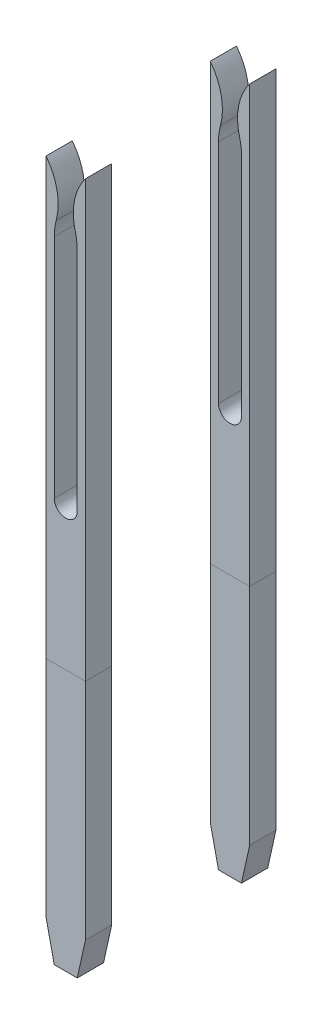
ISO-10303-21;
HEADER;
FILE_DESCRIPTION(('STEP AP214'),'2;1');
FILE_NAME('part.step','',(''),(''),'','','');
FILE_SCHEMA(('AUTOMOTIVE_DESIGN { 1 0 10303 214 1 1 1 1 }'));
ENDSEC;
DATA;
#1=APPLICATION_CONTEXT('core data for automotive mechanical design processes');
#2=APPLICATION_PROTOCOL_DEFINITION('international standard','automotive_design',2000,#1);
#3=PRODUCT_CONTEXT('',#1,'mechanical');
#4=PRODUCT('Part','Part','',(#3));
#5=PRODUCT_RELATED_PRODUCT_CATEGORY('part','',(#4));
#6=PRODUCT_DEFINITION_FORMATION('','',#4);
#7=PRODUCT_DEFINITION_CONTEXT('part definition',#1,'design');
#8=PRODUCT_DEFINITION('design','',#6,#7);
#9=PRODUCT_DEFINITION_SHAPE('','',#8);
#10=(LENGTH_UNIT() NAMED_UNIT(*) SI_UNIT(.MILLI.,.METRE.));
#11=(NAMED_UNIT(*) PLANE_ANGLE_UNIT() SI_UNIT($,.RADIAN.));
#12=(NAMED_UNIT(*) SI_UNIT($,.STERADIAN.) SOLID_ANGLE_UNIT());
#13=UNCERTAINTY_MEASURE_WITH_UNIT(LENGTH_MEASURE(1.E-05),#10,'distance_accuracy_value','');
#14=(GEOMETRIC_REPRESENTATION_CONTEXT(3) GLOBAL_UNCERTAINTY_ASSIGNED_CONTEXT((#13)) GLOBAL_UNIT_ASSIGNED_CONTEXT((#10,
#11,#12)) REPRESENTATION_CONTEXT('',''));
#15=CARTESIAN_POINT('',(0.,0.,0.));
#16=DIRECTION('',(0.,0.,1.));
#17=DIRECTION('',(1.,0.,0.));
#18=AXIS2_PLACEMENT_3D('',#15,#16,#17);
#19=CARTESIAN_POINT('',(0.72644,6.35,3.82274948026913));
#20=DIRECTION('',(0.,0.,-1.));
#21=DIRECTION('',(-1.,0.,0.));
#22=AXIS2_PLACEMENT_3D('',#19,#20,#21);
#23=CYLINDRICAL_SURFACE('',#22,0.90424);
#24=CARTESIAN_POINT('',(0.72644,6.35,-1.0668));
#25=DIRECTION('',(0.,0.,-1.));
#26=DIRECTION('',(0.,1.,0.));
#27=AXIS2_PLACEMENT_3D('',#24,#25,#26);
#28=CIRCLE('',#27,0.90424);
#29=CARTESIAN_POINT('',(-0.1778,6.35,-1.0668));
#30=VERTEX_POINT('',#29);
#31=CARTESIAN_POINT('',(-0.147467238827182,6.58224150259041,-1.0668));
#32=VERTEX_POINT('',#31);
#33=EDGE_CURVE('P0_E179',#30,#32,#28,.T.);
#34=ORIENTED_EDGE('',*,*,#33,.F.);
#35=DIRECTION('',(0.,0.,-1.));
#36=VECTOR('',#35,1.);
#37=CARTESIAN_POINT('',(-0.1778,6.35,3.82274948026913));
#38=LINE('',#37,#36);
#39=CARTESIAN_POINT('',(-0.1778,6.35,-1.4732));
#40=VERTEX_POINT('',#39);
#41=EDGE_CURVE('P0_E11',#30,#40,#38,.T.);
#42=ORIENTED_EDGE('',*,*,#41,.T.);
#43=CARTESIAN_POINT('',(0.72644,6.35,-1.4732));
#44=DIRECTION('',(0.,0.,1.));
#45=DIRECTION('',(0.,1.,0.));
#46=AXIS2_PLACEMENT_3D('',#43,#44,#45);
#47=CIRCLE('',#46,0.90424);
#48=CARTESIAN_POINT('',(-0.147467238827182,6.58224150259041,-1.4732));
#49=VERTEX_POINT('',#48);
#50=EDGE_CURVE('P0_E151',#49,#40,#47,.T.);
#51=ORIENTED_EDGE('',*,*,#50,.F.);
#52=DIRECTION('',(0.,0.,-1.));
#53=VECTOR('',#52,1.);
#54=CARTESIAN_POINT('',(-0.147467238827182,6.58224150259041,3.82274948026913));
#55=LINE('',#54,#53);
#56=EDGE_CURVE('P0_E42',#32,#49,#55,.T.);
#57=ORIENTED_EDGE('',*,*,#56,.F.);
#58=EDGE_LOOP('',(#34,#42,#51,#57));
#59=FACE_BOUND('',#58,.T.);
#60=ADVANCED_FACE('P0_F17',(#59),#23,.F.);
#61=CARTESIAN_POINT('',(-0.1778,0.,3.82274948026913));
#62=DIRECTION('',(1.,0.,0.));
#63=DIRECTION('',(0.,1.,0.));
#64=AXIS2_PLACEMENT_3D('',#61,#62,#63);
#65=PLANE('',#64);
#66=DIRECTION('',(0.,1.,0.));
#67=VECTOR('',#66,1.);
#68=CARTESIAN_POINT('',(-0.1778,0.,-1.0668));
#69=LINE('',#68,#67);
#70=CARTESIAN_POINT('',(-0.1778,2.8448,-1.0668));
#71=VERTEX_POINT('',#70);
#72=EDGE_CURVE('P0_E149',#71,#30,#69,.T.);
#73=ORIENTED_EDGE('',*,*,#72,.F.);
#74=DIRECTION('',(0.,0.,-1.));
#75=VECTOR('',#74,1.);
#76=CARTESIAN_POINT('',(-0.1778,2.8448,3.82274948026913));
#77=LINE('',#76,#75);
#78=CARTESIAN_POINT('',(-0.1778,2.8448,-1.4732));
#79=VERTEX_POINT('',#78);
#80=EDGE_CURVE('P0_E28',#71,#79,#77,.T.);
#81=ORIENTED_EDGE('',*,*,#80,.T.);
#82=DIRECTION('',(0.,-1.,0.));
#83=VECTOR('',#82,1.);
#84=CARTESIAN_POINT('',(-0.1778,0.,-1.4732));
#85=LINE('',#84,#83);
#86=EDGE_CURVE('P0_E155',#40,#79,#85,.T.);
#87=ORIENTED_EDGE('',*,*,#86,.F.);
#88=ORIENTED_EDGE('',*,*,#41,.F.);
#89=EDGE_LOOP('',(#73,#81,#87,#88));
#90=FACE_BOUND('',#89,.T.);
#91=ADVANCED_FACE('P0_F401',(#90),#65,.T.);
#92=CARTESIAN_POINT('',(0.,2.8448,3.82274948026913));
#93=DIRECTION('',(0.,0.,-1.));
#94=DIRECTION('',(-1.,0.,0.));
#95=AXIS2_PLACEMENT_3D('',#92,#93,#94);
#96=CYLINDRICAL_SURFACE('',#95,0.1778);
#97=ORIENTED_EDGE('',*,*,#80,.F.);
#98=CARTESIAN_POINT('',(0.,2.8448,-1.0668));
#99=DIRECTION('',(0.,0.,1.));
#100=DIRECTION('',(0.,1.,0.));
#101=AXIS2_PLACEMENT_3D('',#98,#99,#100);
#102=CIRCLE('',#101,0.1778);
#103=CARTESIAN_POINT('',(0.1778,2.8448,-1.0668));
#104=VERTEX_POINT('',#103);
#105=EDGE_CURVE('P0_E187',#71,#104,#102,.T.);
#106=ORIENTED_EDGE('',*,*,#105,.T.);
#107=DIRECTION('',(0.,0.,-1.));
#108=VECTOR('',#107,1.);
#109=CARTESIAN_POINT('',(0.1778,2.8448,3.82274948026913));
#110=LINE('',#109,#108);
#111=CARTESIAN_POINT('',(0.1778,2.8448,-1.4732));
#112=VERTEX_POINT('',#111);
#113=EDGE_CURVE('P0_E183',#104,#112,#110,.T.);
#114=ORIENTED_EDGE('',*,*,#113,.T.);
#115=CARTESIAN_POINT('',(0.,2.8448,-1.4732));
#116=DIRECTION('',(0.,0.,-1.));
#117=DIRECTION('',(0.,1.,0.));
#118=AXIS2_PLACEMENT_3D('',#115,#116,#117);
#119=CIRCLE('',#118,0.1778);
#120=EDGE_CURVE('P0_E207',#112,#79,#119,.T.);
#121=ORIENTED_EDGE('',*,*,#120,.T.);
#122=EDGE_LOOP('',(#97,#106,#114,#121));
#123=FACE_BOUND('',#122,.T.);
#124=ADVANCED_FACE('P0_F236',(#123),#96,.F.);
#125=CARTESIAN_POINT('',(0.1778,0.,3.82274948026913));
#126=DIRECTION('',(1.,0.,0.));
#127=DIRECTION('',(0.,1.,0.));
#128=AXIS2_PLACEMENT_3D('',#125,#126,#127);
#129=PLANE('',#128);
#130=ORIENTED_EDGE('',*,*,#113,.F.);
#131=DIRECTION('',(0.,1.,0.));
#132=VECTOR('',#131,1.);
#133=CARTESIAN_POINT('',(0.1778,0.,-1.0668));
#134=LINE('',#133,#132);
#135=CARTESIAN_POINT('',(0.1778,6.35,-1.0668));
#136=VERTEX_POINT('',#135);
#137=EDGE_CURVE('P0_E175',#104,#136,#134,.T.);
#138=ORIENTED_EDGE('',*,*,#137,.T.);
#139=DIRECTION('',(0.,0.,-1.));
#140=VECTOR('',#139,1.);
#141=CARTESIAN_POINT('',(0.1778,6.35,3.82274948026913));
#142=LINE('',#141,#140);
#143=CARTESIAN_POINT('',(0.1778,6.35,-1.4732));
#144=VERTEX_POINT('',#143);
#145=EDGE_CURVE('P0_E180',#136,#144,#142,.T.);
#146=ORIENTED_EDGE('',*,*,#145,.T.);
#147=DIRECTION('',(0.,-1.,0.));
#148=VECTOR('',#147,1.);
#149=CARTESIAN_POINT('',(0.1778,0.,-1.4732));
#150=LINE('',#149,#148);
#151=EDGE_CURVE('P0_E224',#144,#112,#150,.T.);
#152=ORIENTED_EDGE('',*,*,#151,.T.);
#153=EDGE_LOOP('',(#130,#138,#146,#152));
#154=FACE_BOUND('',#153,.T.);
#155=ADVANCED_FACE('P0_F241',(#154),#129,.F.);
#156=CARTESIAN_POINT('',(-0.72644,6.35,3.82274948026913));
#157=DIRECTION('',(0.,0.,-1.));
#158=DIRECTION('',(-1.,0.,0.));
#159=AXIS2_PLACEMENT_3D('',#156,#157,#158);
#160=CYLINDRICAL_SURFACE('',#159,0.90424);
#161=ORIENTED_EDGE('',*,*,#145,.F.);
#162=CARTESIAN_POINT('',(-0.72644,6.35,-1.0668));
#163=DIRECTION('',(0.,0.,1.));
#164=DIRECTION('',(0.,1.,0.));
#165=AXIS2_PLACEMENT_3D('',#162,#163,#164);
#166=CIRCLE('',#165,0.90424);
#167=CARTESIAN_POINT('',(0.147467238827181,6.58224150259041,-1.0668));
#168=VERTEX_POINT('',#167);
#169=EDGE_CURVE('P0_E172',#136,#168,#166,.T.);
#170=ORIENTED_EDGE('',*,*,#169,.T.);
#171=DIRECTION('',(0.,0.,-1.));
#172=VECTOR('',#171,1.);
#173=CARTESIAN_POINT('',(0.147467238827181,6.58224150259041,3.82274948026913));
#174=LINE('',#173,#172);
#175=CARTESIAN_POINT('',(0.147467238827181,6.58224150259041,-1.4732));
#176=VERTEX_POINT('',#175);
#177=EDGE_CURVE('P0_E184',#168,#176,#174,.T.);
#178=ORIENTED_EDGE('',*,*,#177,.T.);
#179=CARTESIAN_POINT('',(-0.72644,6.35,-1.4732));
#180=DIRECTION('',(0.,0.,-1.));
#181=DIRECTION('',(0.,1.,0.));
#182=AXIS2_PLACEMENT_3D('',#179,#180,#181);
#183=CIRCLE('',#182,0.90424);
#184=EDGE_CURVE('P0_E166',#176,#144,#183,.T.);
#185=ORIENTED_EDGE('',*,*,#184,.T.);
#186=EDGE_LOOP('',(#161,#170,#178,#185));
#187=FACE_BOUND('',#186,.T.);
#188=ADVANCED_FACE('P0_F439',(#187),#160,.F.);
#189=CARTESIAN_POINT('',(1.02137447765436,6.81448300518082,3.82274948026913));
#190=DIRECTION('',(0.,0.,-1.));
#191=DIRECTION('',(-1.,0.,0.));
#192=AXIS2_PLACEMENT_3D('',#189,#190,#191);
#193=CYLINDRICAL_SURFACE('',#192,0.90424);
#194=ORIENTED_EDGE('',*,*,#177,.F.);
#195=CARTESIAN_POINT('',(1.02137447765436,6.81448300518082,-1.0668));
#196=DIRECTION('',(0.,0.,-1.));
#197=DIRECTION('',(0.,1.,0.));
#198=AXIS2_PLACEMENT_3D('',#195,#196,#197);
#199=CIRCLE('',#198,0.90424);
#200=CARTESIAN_POINT('',(0.3048,7.366,-1.0668));
#201=VERTEX_POINT('',#200);
#202=EDGE_CURVE('P0_E165',#168,#201,#199,.T.);
#203=ORIENTED_EDGE('',*,*,#202,.T.);
#204=DIRECTION('',(0.,0.,-1.));
#205=VECTOR('',#204,1.);
#206=CARTESIAN_POINT('',(0.3048,7.366,3.82274948026913));
#207=LINE('',#206,#205);
#208=CARTESIAN_POINT('',(0.3048,7.366,-1.4732));
#209=VERTEX_POINT('',#208);
#210=EDGE_CURVE('P0_E123',#201,#209,#207,.T.);
#211=ORIENTED_EDGE('',*,*,#210,.T.);
#212=CARTESIAN_POINT('',(1.02137447765436,6.81448300518082,-1.4732));
#213=DIRECTION('',(0.,0.,1.));
#214=DIRECTION('',(0.,1.,0.));
#215=AXIS2_PLACEMENT_3D('',#212,#213,#214);
#216=CIRCLE('',#215,0.90424);
#217=EDGE_CURVE('P0_E117',#209,#176,#216,.T.);
#218=ORIENTED_EDGE('',*,*,#217,.T.);
#219=EDGE_LOOP('',(#194,#203,#211,#218));
#220=FACE_BOUND('',#219,.T.);
#221=ADVANCED_FACE('P0_F427',(#220),#193,.T.);
#222=CARTESIAN_POINT('',(-1.02137447765436,6.81448300518082,3.82274948026913));
#223=DIRECTION('',(0.,0.,-1.));
#224=DIRECTION('',(-1.,0.,0.));
#225=AXIS2_PLACEMENT_3D('',#222,#223,#224);
#226=CYLINDRICAL_SURFACE('',#225,0.90424);
#227=CARTESIAN_POINT('',(-1.02137447765436,6.81448300518082,-1.0668));
#228=DIRECTION('',(0.,0.,1.));
#229=DIRECTION('',(0.,1.,0.));
#230=AXIS2_PLACEMENT_3D('',#227,#228,#229);
#231=CIRCLE('',#230,0.90424);
#232=CARTESIAN_POINT('',(-0.3048,7.366,-1.0668));
#233=VERTEX_POINT('',#232);
#234=EDGE_CURVE('P0_E95',#32,#233,#231,.T.);
#235=ORIENTED_EDGE('',*,*,#234,.F.);
#236=ORIENTED_EDGE('',*,*,#56,.T.);
#237=CARTESIAN_POINT('',(-1.02137447765436,6.81448300518082,-1.4732));
#238=DIRECTION('',(0.,0.,-1.));
#239=DIRECTION('',(0.,1.,0.));
#240=AXIS2_PLACEMENT_3D('',#237,#238,#239);
#241=CIRCLE('',#240,0.90424);
#242=CARTESIAN_POINT('',(-0.3048,7.366,-1.4732));
#243=VERTEX_POINT('',#242);
#244=EDGE_CURVE('P0_E156',#243,#49,#241,.T.);
#245=ORIENTED_EDGE('',*,*,#244,.F.);
#246=DIRECTION('',(0.,0.,-1.));
#247=VECTOR('',#246,1.);
#248=CARTESIAN_POINT('',(-0.3048,7.366,3.82274948026913));
#249=LINE('',#248,#247);
#250=EDGE_CURVE('P0_E160',#233,#243,#249,.T.);
#251=ORIENTED_EDGE('',*,*,#250,.F.);
#252=EDGE_LOOP('',(#235,#236,#245,#251));
#253=FACE_BOUND('',#252,.T.);
#254=ADVANCED_FACE('P0_F422',(#253),#226,.T.);
#255=CARTESIAN_POINT('',(0.3048,2.5146,-1.0668));
#256=DIRECTION('',(0.,0.,-1.));
#257=DIRECTION('',(-1.,0.,0.));
#258=AXIS2_PLACEMENT_3D('',#255,#256,#257);
#259=PLANE('',#258);
#260=DIRECTION('',(0.,-1.,0.));
#261=VECTOR('',#260,1.);
#262=CARTESIAN_POINT('',(-0.3048,2.5146,-1.0668));
#263=LINE('',#262,#261);
#264=CARTESIAN_POINT('',(-0.3048,0.635,-1.0668));
#265=VERTEX_POINT('',#264);
#266=EDGE_CURVE('P0_E171',#233,#265,#263,.T.);
#267=ORIENTED_EDGE('',*,*,#266,.T.);
#268=DIRECTION('',(1.,0.,0.));
#269=VECTOR('',#268,1.);
#270=CARTESIAN_POINT('',(0.3048,0.635,-1.0668));
#271=LINE('',#270,#269);
#272=CARTESIAN_POINT('',(0.3048,0.635,-1.0668));
#273=VERTEX_POINT('',#272);
#274=EDGE_CURVE('P0_E138',#265,#273,#271,.T.);
#275=ORIENTED_EDGE('',*,*,#274,.T.);
#276=DIRECTION('',(0.,-1.,0.));
#277=VECTOR('',#276,1.);
#278=CARTESIAN_POINT('',(0.3048,2.5146,-1.0668));
#279=LINE('',#278,#277);
#280=EDGE_CURVE('P0_E135',#201,#273,#279,.T.);
#281=ORIENTED_EDGE('',*,*,#280,.F.);
#282=ORIENTED_EDGE('',*,*,#202,.F.);
#283=ORIENTED_EDGE('',*,*,#169,.F.);
#284=ORIENTED_EDGE('',*,*,#137,.F.);
#285=ORIENTED_EDGE('',*,*,#105,.F.);
#286=ORIENTED_EDGE('',*,*,#72,.T.);
#287=ORIENTED_EDGE('',*,*,#33,.T.);
#288=ORIENTED_EDGE('',*,*,#234,.T.);
#289=EDGE_LOOP('',(#267,#275,#281,#282,#283,#284,#285,#286,#287,#288));
#290=FACE_BOUND('',#289,.T.);
#291=ADVANCED_FACE('P0_F19',(#290),#259,.F.);
#292=CARTESIAN_POINT('',(0.3048,-3.4036,-1.4732));
#293=DIRECTION('',(0.,0.,1.));
#294=DIRECTION('',(1.,0.,0.));
#295=AXIS2_PLACEMENT_3D('',#292,#293,#294);
#296=PLANE('',#295);
#297=DIRECTION('',(0.,1.,0.));
#298=VECTOR('',#297,1.);
#299=CARTESIAN_POINT('',(0.3048,-3.4036,-1.4732));
#300=LINE('',#299,#298);
#301=CARTESIAN_POINT('',(0.3048,0.635,-1.4732));
#302=VERTEX_POINT('',#301);
#303=EDGE_CURVE('P0_E109',#302,#209,#300,.T.);
#304=ORIENTED_EDGE('',*,*,#303,.F.);
#305=DIRECTION('',(-1.,0.,0.));
#306=VECTOR('',#305,1.);
#307=CARTESIAN_POINT('',(0.3048,0.635,-1.4732));
#308=LINE('',#307,#306);
#309=CARTESIAN_POINT('',(-0.3048,0.635,-1.4732));
#310=VERTEX_POINT('',#309);
#311=EDGE_CURVE('P0_E113',#302,#310,#308,.T.);
#312=ORIENTED_EDGE('',*,*,#311,.T.);
#313=DIRECTION('',(0.,1.,0.));
#314=VECTOR('',#313,1.);
#315=CARTESIAN_POINT('',(-0.3048,-3.4036,-1.4732));
#316=LINE('',#315,#314);
#317=EDGE_CURVE('P0_E163',#310,#243,#316,.T.);
#318=ORIENTED_EDGE('',*,*,#317,.T.);
#319=ORIENTED_EDGE('',*,*,#244,.T.);
#320=ORIENTED_EDGE('',*,*,#50,.T.);
#321=ORIENTED_EDGE('',*,*,#86,.T.);
#322=ORIENTED_EDGE('',*,*,#120,.F.);
#323=ORIENTED_EDGE('',*,*,#151,.F.);
#324=ORIENTED_EDGE('',*,*,#184,.F.);
#325=ORIENTED_EDGE('',*,*,#217,.F.);
#326=EDGE_LOOP('',(#304,#312,#318,#319,#320,#321,#322,#323,#324,#325));
#327=FACE_BOUND('',#326,.T.);
#328=ADVANCED_FACE('P0_F111',(#327),#296,.F.);
#329=CARTESIAN_POINT('',(-0.3048,0.,0.));
#330=DIRECTION('',(1.,0.,0.));
#331=DIRECTION('',(0.,1.,0.));
#332=AXIS2_PLACEMENT_3D('',#329,#330,#331);
#333=PLANE('',#332);
#334=ORIENTED_EDGE('',*,*,#317,.F.);
#335=DIRECTION('',(0.,0.,1.));
#336=VECTOR('',#335,1.);
#337=CARTESIAN_POINT('',(-0.3048,0.635,0.));
#338=LINE('',#337,#336);
#339=EDGE_CURVE('P0_E130',#310,#265,#338,.T.);
#340=ORIENTED_EDGE('',*,*,#339,.T.);
#341=ORIENTED_EDGE('',*,*,#266,.F.);
#342=ORIENTED_EDGE('',*,*,#250,.T.);
#343=EDGE_LOOP('',(#334,#340,#341,#342));
#344=FACE_BOUND('',#343,.T.);
#345=ADVANCED_FACE('P0_F458',(#344),#333,.F.);
#346=CARTESIAN_POINT('',(0.3048,0.,0.));
#347=DIRECTION('',(1.,0.,0.));
#348=DIRECTION('',(0.,1.,0.));
#349=AXIS2_PLACEMENT_3D('',#346,#347,#348);
#350=PLANE('',#349);
#351=DIRECTION('',(0.,0.,1.));
#352=VECTOR('',#351,1.);
#353=CARTESIAN_POINT('',(0.3048,0.635,0.));
#354=LINE('',#353,#352);
#355=EDGE_CURVE('P0_E21',#302,#273,#354,.T.);
#356=ORIENTED_EDGE('',*,*,#355,.F.);
#357=ORIENTED_EDGE('',*,*,#303,.T.);
#358=ORIENTED_EDGE('',*,*,#210,.F.);
#359=ORIENTED_EDGE('',*,*,#280,.T.);
#360=EDGE_LOOP('',(#356,#357,#358,#359));
#361=FACE_BOUND('',#360,.T.);
#362=ADVANCED_FACE('P0_F133',(#361),#350,.T.);
#363=CARTESIAN_POINT('',(0.,0.635,0.));
#364=DIRECTION('',(0.,1.,0.));
#365=DIRECTION('',(1.,0.,0.));
#366=AXIS2_PLACEMENT_3D('',#363,#364,#365);
#367=PLANE('',#366);
#368=ORIENTED_EDGE('',*,*,#355,.T.);
#369=ORIENTED_EDGE('',*,*,#274,.F.);
#370=ORIENTED_EDGE('',*,*,#339,.F.);
#371=ORIENTED_EDGE('',*,*,#311,.F.);
#372=EDGE_LOOP('',(#368,#369,#370,#371));
#373=FACE_BOUND('',#372,.T.);
#374=ADVANCED_FACE('P0_F127',(#373),#367,.F.);
#375=CLOSED_SHELL('',(#60,#91,#124,#155,#188,#221,#254,#291,#328,#345,#362,#374));
#376=MANIFOLD_SOLID_BREP('P0_B1',#375);
#377=CARTESIAN_POINT('',(0.,0.635,0.));
#378=DIRECTION('',(0.,1.,0.));
#379=DIRECTION('',(1.,0.,0.));
#380=AXIS2_PLACEMENT_3D('',#377,#378,#379);
#381=PLANE('',#380);
#382=DIRECTION('',(0.,0.,1.));
#383=VECTOR('',#382,1.);
#384=CARTESIAN_POINT('',(0.3048,0.635,0.));
#385=LINE('',#384,#383);
#386=CARTESIAN_POINT('',(0.3048,0.635,-1.4732));
#387=VERTEX_POINT('',#386);
#388=CARTESIAN_POINT('',(0.3048,0.635,-1.0668));
#389=VERTEX_POINT('',#388);
#390=EDGE_CURVE('P1_E72',#387,#389,#385,.T.);
#391=ORIENTED_EDGE('',*,*,#390,.F.);
#392=DIRECTION('',(-1.,0.,0.));
#393=VECTOR('',#392,1.);
#394=CARTESIAN_POINT('',(0.3048,0.635,-1.4732));
#395=LINE('',#394,#393);
#396=CARTESIAN_POINT('',(-0.3048,0.635,-1.4732));
#397=VERTEX_POINT('',#396);
#398=EDGE_CURVE('P1_E139',#387,#397,#395,.T.);
#399=ORIENTED_EDGE('',*,*,#398,.T.);
#400=DIRECTION('',(0.,0.,1.));
#401=VECTOR('',#400,1.);
#402=CARTESIAN_POINT('',(-0.3048,0.635,0.));
#403=LINE('',#402,#401);
#404=CARTESIAN_POINT('',(-0.3048,0.635,-1.0668));
#405=VERTEX_POINT('',#404);
#406=EDGE_CURVE('P1_E81',#397,#405,#403,.T.);
#407=ORIENTED_EDGE('',*,*,#406,.T.);
#408=DIRECTION('',(1.,0.,0.));
#409=VECTOR('',#408,1.);
#410=CARTESIAN_POINT('',(0.3048,0.635,-1.0668));
#411=LINE('',#410,#409);
#412=EDGE_CURVE('P1_E112',#405,#389,#411,.T.);
#413=ORIENTED_EDGE('',*,*,#412,.T.);
#414=EDGE_LOOP('',(#391,#399,#407,#413));
#415=FACE_BOUND('',#414,.T.);
#416=ADVANCED_FACE('P1_F17',(#415),#381,.T.);
#417=CARTESIAN_POINT('',(0.1778,-3.4036,-1.4732));
#418=DIRECTION('',(-0.976296007119935,0.216439613938095,0.));
#419=DIRECTION('',(0.,0.,1.));
#420=AXIS2_PLACEMENT_3D('',#417,#418,#419);
#421=PLANE('',#420);
#422=DIRECTION('',(0.,0.,1.));
#423=VECTOR('',#422,1.);
#424=CARTESIAN_POINT('',(0.1778,-3.4036,-1.4732));
#425=LINE('',#424,#423);
#426=CARTESIAN_POINT('',(0.1778,-3.4036,-1.4732));
#427=VERTEX_POINT('',#426);
#428=CARTESIAN_POINT('',(0.1778,-3.4036,-1.0668));
#429=VERTEX_POINT('',#428);
#430=EDGE_CURVE('P1_E11',#427,#429,#425,.T.);
#431=ORIENTED_EDGE('',*,*,#430,.F.);
#432=DIRECTION('',(-0.216439613938095,-0.976296007119935,0.));
#433=VECTOR('',#432,1.);
#434=CARTESIAN_POINT('',(0.1778,-3.4036,-1.4732));
#435=LINE('',#434,#433);
#436=CARTESIAN_POINT('',(0.3048,-2.8307400200349,-1.4732));
#437=VERTEX_POINT('',#436);
#438=EDGE_CURVE('P1_E138',#437,#427,#435,.T.);
#439=ORIENTED_EDGE('',*,*,#438,.F.);
#440=DIRECTION('',(0.,0.,1.));
#441=VECTOR('',#440,1.);
#442=CARTESIAN_POINT('',(0.3048,-2.8307400200349,-1.4732));
#443=LINE('',#442,#441);
#444=CARTESIAN_POINT('',(0.3048,-2.8307400200349,-1.0668));
#445=VERTEX_POINT('',#444);
#446=EDGE_CURVE('P1_E41',#437,#445,#443,.T.);
#447=ORIENTED_EDGE('',*,*,#446,.T.);
#448=DIRECTION('',(0.216439613938095,0.976296007119935,0.));
#449=VECTOR('',#448,1.);
#450=CARTESIAN_POINT('',(1.43431915384004,2.2641916322407,-1.0668));
#451=LINE('',#450,#449);
#452=EDGE_CURVE('P1_E122',#429,#445,#451,.T.);
#453=ORIENTED_EDGE('',*,*,#452,.F.);
#454=EDGE_LOOP('',(#431,#439,#447,#453));
#455=FACE_BOUND('',#454,.T.);
#456=ADVANCED_FACE('P1_F273',(#455),#421,.F.);
#457=CARTESIAN_POINT('',(-0.1778,-3.4036,-1.4732));
#458=DIRECTION('',(0.976296007119935,0.216439613938096,0.));
#459=DIRECTION('',(0.,0.,-1.));
#460=AXIS2_PLACEMENT_3D('',#457,#458,#459);
#461=PLANE('',#460);
#462=DIRECTION('',(0.,0.,1.));
#463=VECTOR('',#462,1.);
#464=CARTESIAN_POINT('',(-0.3048,-2.8307400200349,-1.4732));
#465=LINE('',#464,#463);
#466=CARTESIAN_POINT('',(-0.3048,-2.8307400200349,-1.4732));
#467=VERTEX_POINT('',#466);
#468=CARTESIAN_POINT('',(-0.3048,-2.8307400200349,-1.0668));
#469=VERTEX_POINT('',#468);
#470=EDGE_CURVE('P1_E91',#467,#469,#465,.T.);
#471=ORIENTED_EDGE('',*,*,#470,.F.);
#472=DIRECTION('',(-0.216439613938096,0.976296007119935,0.));
#473=VECTOR('',#472,1.);
#474=CARTESIAN_POINT('',(-0.1778,-3.4036,-1.4732));
#475=LINE('',#474,#473);
#476=CARTESIAN_POINT('',(-0.1778,-3.4036,-1.4732));
#477=VERTEX_POINT('',#476);
#478=EDGE_CURVE('P1_E141',#477,#467,#475,.T.);
#479=ORIENTED_EDGE('',*,*,#478,.F.);
#480=DIRECTION('',(0.,0.,1.));
#481=VECTOR('',#480,1.);
#482=CARTESIAN_POINT('',(-0.1778,-3.4036,-1.4732));
#483=LINE('',#482,#481);
#484=CARTESIAN_POINT('',(-0.1778,-3.4036,-1.0668));
#485=VERTEX_POINT('',#484);
#486=EDGE_CURVE('P1_E27',#477,#485,#483,.T.);
#487=ORIENTED_EDGE('',*,*,#486,.T.);
#488=DIRECTION('',(0.216439613938096,-0.976296007119935,0.));
#489=VECTOR('',#488,1.);
#490=CARTESIAN_POINT('',(-1.40576176732881,2.13537758606214,-1.0668));
#491=LINE('',#490,#489);
#492=EDGE_CURVE('P1_E20',#469,#485,#491,.T.);
#493=ORIENTED_EDGE('',*,*,#492,.F.);
#494=EDGE_LOOP('',(#471,#479,#487,#493));
#495=FACE_BOUND('',#494,.T.);
#496=ADVANCED_FACE('P1_F104',(#495),#461,.F.);
#497=CARTESIAN_POINT('',(0.3048,-3.4036,-1.0668));
#498=DIRECTION('',(0.,1.,0.));
#499=DIRECTION('',(1.,0.,0.));
#500=AXIS2_PLACEMENT_3D('',#497,#498,#499);
#501=PLANE('',#500);
#502=DIRECTION('',(-1.,0.,0.));
#503=VECTOR('',#502,1.);
#504=CARTESIAN_POINT('',(0.3048,-3.4036,-1.0668));
#505=LINE('',#504,#503);
#506=EDGE_CURVE('P1_E109',#429,#485,#505,.T.);
#507=ORIENTED_EDGE('',*,*,#506,.T.);
#508=ORIENTED_EDGE('',*,*,#486,.F.);
#509=DIRECTION('',(-1.,0.,0.));
#510=VECTOR('',#509,1.);
#511=CARTESIAN_POINT('',(0.3048,-3.4036,-1.4732));
#512=LINE('',#511,#510);
#513=EDGE_CURVE('P1_E120',#427,#477,#512,.T.);
#514=ORIENTED_EDGE('',*,*,#513,.F.);
#515=ORIENTED_EDGE('',*,*,#430,.T.);
#516=EDGE_LOOP('',(#507,#508,#514,#515));
#517=FACE_BOUND('',#516,.T.);
#518=ADVANCED_FACE('P1_F283',(#517),#501,.F.);
#519=CARTESIAN_POINT('',(-0.3048,0.,0.));
#520=DIRECTION('',(1.,0.,0.));
#521=DIRECTION('',(0.,1.,0.));
#522=AXIS2_PLACEMENT_3D('',#519,#520,#521);
#523=PLANE('',#522);
#524=ORIENTED_EDGE('',*,*,#406,.F.);
#525=DIRECTION('',(0.,1.,0.));
#526=VECTOR('',#525,1.);
#527=CARTESIAN_POINT('',(-0.3048,-3.4036,-1.4732));
#528=LINE('',#527,#526);
#529=EDGE_CURVE('P1_E97',#467,#397,#528,.T.);
#530=ORIENTED_EDGE('',*,*,#529,.F.);
#531=ORIENTED_EDGE('',*,*,#470,.T.);
#532=DIRECTION('',(0.,-1.,0.));
#533=VECTOR('',#532,1.);
#534=CARTESIAN_POINT('',(-0.3048,2.5146,-1.0668));
#535=LINE('',#534,#533);
#536=EDGE_CURVE('P1_E95',#405,#469,#535,.T.);
#537=ORIENTED_EDGE('',*,*,#536,.F.);
#538=EDGE_LOOP('',(#524,#530,#531,#537));
#539=FACE_BOUND('',#538,.T.);
#540=ADVANCED_FACE('P1_F93',(#539),#523,.F.);
#541=CARTESIAN_POINT('',(0.3048,0.,0.));
#542=DIRECTION('',(1.,0.,0.));
#543=DIRECTION('',(0.,1.,0.));
#544=AXIS2_PLACEMENT_3D('',#541,#542,#543);
#545=PLANE('',#544);
#546=DIRECTION('',(0.,1.,0.));
#547=VECTOR('',#546,1.);
#548=CARTESIAN_POINT('',(0.3048,-3.4036,-1.4732));
#549=LINE('',#548,#547);
#550=EDGE_CURVE('P1_E136',#437,#387,#549,.T.);
#551=ORIENTED_EDGE('',*,*,#550,.T.);
#552=ORIENTED_EDGE('',*,*,#390,.T.);
#553=DIRECTION('',(0.,-1.,0.));
#554=VECTOR('',#553,1.);
#555=CARTESIAN_POINT('',(0.3048,2.5146,-1.0668));
#556=LINE('',#555,#554);
#557=EDGE_CURVE('P1_E125',#389,#445,#556,.T.);
#558=ORIENTED_EDGE('',*,*,#557,.T.);
#559=ORIENTED_EDGE('',*,*,#446,.F.);
#560=EDGE_LOOP('',(#551,#552,#558,#559));
#561=FACE_BOUND('',#560,.T.);
#562=ADVANCED_FACE('P1_F298',(#561),#545,.T.);
#563=CARTESIAN_POINT('',(0.3048,2.5146,-1.0668));
#564=DIRECTION('',(0.,0.,-1.));
#565=DIRECTION('',(-1.,0.,0.));
#566=AXIS2_PLACEMENT_3D('',#563,#564,#565);
#567=PLANE('',#566);
#568=ORIENTED_EDGE('',*,*,#412,.F.);
#569=ORIENTED_EDGE('',*,*,#536,.T.);
#570=ORIENTED_EDGE('',*,*,#492,.T.);
#571=ORIENTED_EDGE('',*,*,#506,.F.);
#572=ORIENTED_EDGE('',*,*,#452,.T.);
#573=ORIENTED_EDGE('',*,*,#557,.F.);
#574=EDGE_LOOP('',(#568,#569,#570,#571,#572,#573));
#575=FACE_BOUND('',#574,.T.);
#576=ADVANCED_FACE('P1_F110',(#575),#567,.F.);
#577=CARTESIAN_POINT('',(0.3048,-3.4036,-1.4732));
#578=DIRECTION('',(0.,0.,1.));
#579=DIRECTION('',(1.,0.,0.));
#580=AXIS2_PLACEMENT_3D('',#577,#578,#579);
#581=PLANE('',#580);
#582=ORIENTED_EDGE('',*,*,#398,.F.);
#583=ORIENTED_EDGE('',*,*,#550,.F.);
#584=ORIENTED_EDGE('',*,*,#438,.T.);
#585=ORIENTED_EDGE('',*,*,#513,.T.);
#586=ORIENTED_EDGE('',*,*,#478,.T.);
#587=ORIENTED_EDGE('',*,*,#529,.T.);
#588=EDGE_LOOP('',(#582,#583,#584,#585,#586,#587));
#589=FACE_BOUND('',#588,.T.);
#590=ADVANCED_FACE('P1_F159',(#589),#581,.F.);
#591=CLOSED_SHELL('',(#416,#456,#496,#518,#540,#562,#576,#590));
#592=MANIFOLD_SOLID_BREP('P1_B1',#591);
#593=CARTESIAN_POINT('',(0.3048,2.5146,1.0668));
#594=DIRECTION('',(0.,0.,1.));
#595=DIRECTION('',(0.,-1.,0.));
#596=AXIS2_PLACEMENT_3D('',#593,#594,#595);
#597=PLANE('',#596);
#598=DIRECTION('',(0.,1.,0.));
#599=VECTOR('',#598,1.);
#600=CARTESIAN_POINT('',(0.3048,2.5146,1.0668));
#601=LINE('',#600,#599);
#602=CARTESIAN_POINT('',(0.3048,0.635,1.0668));
#603=VERTEX_POINT('',#602);
#604=CARTESIAN_POINT('',(0.3048,7.366,1.0668));
#605=VERTEX_POINT('',#604);
#606=EDGE_CURVE('P2_E11',#603,#605,#601,.T.);
#607=ORIENTED_EDGE('',*,*,#606,.F.);
#608=DIRECTION('',(-1.,0.,0.));
#609=VECTOR('',#608,1.);
#610=CARTESIAN_POINT('',(0.3048,0.635,1.0668));
#611=LINE('',#610,#609);
#612=CARTESIAN_POINT('',(-0.3048,0.635,1.0668));
#613=VERTEX_POINT('',#612);
#614=EDGE_CURVE('P2_E169',#603,#613,#611,.T.);
#615=ORIENTED_EDGE('',*,*,#614,.T.);
#616=DIRECTION('',(0.,1.,0.));
#617=VECTOR('',#616,1.);
#618=CARTESIAN_POINT('',(-0.3048,2.5146,1.0668));
#619=LINE('',#618,#617);
#620=CARTESIAN_POINT('',(-0.3048,7.366,1.0668));
#621=VERTEX_POINT('',#620);
#622=EDGE_CURVE('P2_E145',#613,#621,#619,.T.);
#623=ORIENTED_EDGE('',*,*,#622,.T.);
#624=CARTESIAN_POINT('',(-1.02137447765436,6.81448300518082,1.0668));
#625=DIRECTION('',(0.,0.,1.));
#626=DIRECTION('',(1.,0.,0.));
#627=AXIS2_PLACEMENT_3D('',#624,#625,#626);
#628=CIRCLE('',#627,0.90424);
#629=CARTESIAN_POINT('',(-0.147467238827182,6.58224150259041,1.0668));
#630=VERTEX_POINT('',#629);
#631=EDGE_CURVE('P2_E21',#630,#621,#628,.T.);
#632=ORIENTED_EDGE('',*,*,#631,.F.);
#633=CARTESIAN_POINT('',(0.72644,6.35,1.0668));
#634=DIRECTION('',(0.,0.,-1.));
#635=DIRECTION('',(1.,0.,0.));
#636=AXIS2_PLACEMENT_3D('',#633,#634,#635);
#637=CIRCLE('',#636,0.90424);
#638=CARTESIAN_POINT('',(-0.1778,6.35,1.0668));
#639=VERTEX_POINT('',#638);
#640=EDGE_CURVE('P2_E42',#639,#630,#637,.T.);
#641=ORIENTED_EDGE('',*,*,#640,.F.);
#642=DIRECTION('',(0.,1.,0.));
#643=VECTOR('',#642,1.);
#644=CARTESIAN_POINT('',(-0.1778,2.8448,1.0668));
#645=LINE('',#644,#643);
#646=CARTESIAN_POINT('',(-0.1778,2.8448,1.0668));
#647=VERTEX_POINT('',#646);
#648=EDGE_CURVE('P2_E70',#647,#639,#645,.T.);
#649=ORIENTED_EDGE('',*,*,#648,.F.);
#650=CARTESIAN_POINT('',(0.,2.8448,1.0668));
#651=DIRECTION('',(0.,0.,-1.));
#652=DIRECTION('',(1.,0.,0.));
#653=AXIS2_PLACEMENT_3D('',#650,#651,#652);
#654=CIRCLE('',#653,0.1778);
#655=CARTESIAN_POINT('',(0.1778,2.8448,1.0668));
#656=VERTEX_POINT('',#655);
#657=EDGE_CURVE('P2_E197',#656,#647,#654,.T.);
#658=ORIENTED_EDGE('',*,*,#657,.F.);
#659=DIRECTION('',(0.,-1.,0.));
#660=VECTOR('',#659,1.);
#661=CARTESIAN_POINT('',(0.1778,6.35,1.0668));
#662=LINE('',#661,#660);
#663=CARTESIAN_POINT('',(0.1778,6.35,1.0668));
#664=VERTEX_POINT('',#663);
#665=EDGE_CURVE('P2_E122',#664,#656,#662,.T.);
#666=ORIENTED_EDGE('',*,*,#665,.F.);
#667=CARTESIAN_POINT('',(-0.72644,6.35,1.0668));
#668=DIRECTION('',(0.,0.,-1.));
#669=DIRECTION('',(1.,0.,0.));
#670=AXIS2_PLACEMENT_3D('',#667,#668,#669);
#671=CIRCLE('',#670,0.90424);
#672=CARTESIAN_POINT('',(0.147467238827181,6.58224150259041,1.0668));
#673=VERTEX_POINT('',#672);
#674=EDGE_CURVE('P2_E227',#673,#664,#671,.T.);
#675=ORIENTED_EDGE('',*,*,#674,.F.);
#676=CARTESIAN_POINT('',(1.02137447765436,6.81448300518082,1.0668));
#677=DIRECTION('',(0.,0.,1.));
#678=DIRECTION('',(1.,0.,0.));
#679=AXIS2_PLACEMENT_3D('',#676,#677,#678);
#680=CIRCLE('',#679,0.90424);
#681=EDGE_CURVE('P2_E202',#605,#673,#680,.T.);
#682=ORIENTED_EDGE('',*,*,#681,.F.);
#683=EDGE_LOOP('',(#607,#615,#623,#632,#641,#649,#658,#666,#675,#682));
#684=FACE_BOUND('',#683,.T.);
#685=ADVANCED_FACE('P2_F17',(#684),#597,.F.);
#686=CARTESIAN_POINT('',(0.3048,-3.4036,1.4732));
#687=DIRECTION('',(0.,0.,-1.));
#688=DIRECTION('',(0.,-1.,0.));
#689=AXIS2_PLACEMENT_3D('',#686,#687,#688);
#690=PLANE('',#689);
#691=DIRECTION('',(0.,-1.,0.));
#692=VECTOR('',#691,1.);
#693=CARTESIAN_POINT('',(-0.3048,-3.4036,1.4732));
#694=LINE('',#693,#692);
#695=CARTESIAN_POINT('',(-0.3048,7.366,1.4732));
#696=VERTEX_POINT('',#695);
#697=CARTESIAN_POINT('',(-0.3048,0.635,1.4732));
#698=VERTEX_POINT('',#697);
#699=EDGE_CURVE('P2_E133',#696,#698,#694,.T.);
#700=ORIENTED_EDGE('',*,*,#699,.T.);
#701=DIRECTION('',(1.,0.,0.));
#702=VECTOR('',#701,1.);
#703=CARTESIAN_POINT('',(0.3048,0.635,1.4732));
#704=LINE('',#703,#702);
#705=CARTESIAN_POINT('',(0.3048,0.635,1.4732));
#706=VERTEX_POINT('',#705);
#707=EDGE_CURVE('P2_E185',#698,#706,#704,.T.);
#708=ORIENTED_EDGE('',*,*,#707,.T.);
#709=DIRECTION('',(0.,-1.,0.));
#710=VECTOR('',#709,1.);
#711=CARTESIAN_POINT('',(0.3048,-3.4036,1.4732));
#712=LINE('',#711,#710);
#713=CARTESIAN_POINT('',(0.3048,7.366,1.4732));
#714=VERTEX_POINT('',#713);
#715=EDGE_CURVE('P2_E28',#714,#706,#712,.T.);
#716=ORIENTED_EDGE('',*,*,#715,.F.);
#717=CARTESIAN_POINT('',(1.02137447765436,6.81448300518082,1.4732));
#718=DIRECTION('',(0.,0.,1.));
#719=DIRECTION('',(1.,0.,0.));
#720=AXIS2_PLACEMENT_3D('',#717,#718,#719);
#721=CIRCLE('',#720,0.90424);
#722=CARTESIAN_POINT('',(0.147467238827181,6.58224150259041,1.4732));
#723=VERTEX_POINT('',#722);
#724=EDGE_CURVE('P2_E153',#714,#723,#721,.T.);
#725=ORIENTED_EDGE('',*,*,#724,.T.);
#726=CARTESIAN_POINT('',(-0.72644,6.35,1.4732));
#727=DIRECTION('',(0.,0.,-1.));
#728=DIRECTION('',(1.,0.,0.));
#729=AXIS2_PLACEMENT_3D('',#726,#727,#728);
#730=CIRCLE('',#729,0.90424);
#731=CARTESIAN_POINT('',(0.1778,6.35,1.4732));
#732=VERTEX_POINT('',#731);
#733=EDGE_CURVE('P2_E211',#723,#732,#730,.T.);
#734=ORIENTED_EDGE('',*,*,#733,.T.);
#735=DIRECTION('',(0.,-1.,0.));
#736=VECTOR('',#735,1.);
#737=CARTESIAN_POINT('',(0.1778,6.35,1.4732));
#738=LINE('',#737,#736);
#739=CARTESIAN_POINT('',(0.1778,2.8448,1.4732));
#740=VERTEX_POINT('',#739);
#741=EDGE_CURVE('P2_E116',#732,#740,#738,.T.);
#742=ORIENTED_EDGE('',*,*,#741,.T.);
#743=CARTESIAN_POINT('',(0.,2.8448,1.4732));
#744=DIRECTION('',(0.,0.,-1.));
#745=DIRECTION('',(1.,0.,0.));
#746=AXIS2_PLACEMENT_3D('',#743,#744,#745);
#747=CIRCLE('',#746,0.1778);
#748=CARTESIAN_POINT('',(-0.1778,2.8448,1.4732));
#749=VERTEX_POINT('',#748);
#750=EDGE_CURVE('P2_E201',#740,#749,#747,.T.);
#751=ORIENTED_EDGE('',*,*,#750,.T.);
#752=DIRECTION('',(0.,1.,0.));
#753=VECTOR('',#752,1.);
#754=CARTESIAN_POINT('',(-0.1778,2.8448,1.4732));
#755=LINE('',#754,#753);
#756=CARTESIAN_POINT('',(-0.1778,6.35,1.4732));
#757=VERTEX_POINT('',#756);
#758=EDGE_CURVE('P2_E79',#749,#757,#755,.T.);
#759=ORIENTED_EDGE('',*,*,#758,.T.);
#760=CARTESIAN_POINT('',(0.72644,6.35,1.4732));
#761=DIRECTION('',(0.,0.,-1.));
#762=DIRECTION('',(1.,0.,0.));
#763=AXIS2_PLACEMENT_3D('',#760,#761,#762);
#764=CIRCLE('',#763,0.90424);
#765=CARTESIAN_POINT('',(-0.147467238827182,6.58224150259041,1.4732));
#766=VERTEX_POINT('',#765);
#767=EDGE_CURVE('P2_E156',#757,#766,#764,.T.);
#768=ORIENTED_EDGE('',*,*,#767,.T.);
#769=CARTESIAN_POINT('',(-1.02137447765436,6.81448300518082,1.4732));
#770=DIRECTION('',(0.,0.,1.));
#771=DIRECTION('',(1.,0.,0.));
#772=AXIS2_PLACEMENT_3D('',#769,#770,#771);
#773=CIRCLE('',#772,0.90424);
#774=EDGE_CURVE('P2_E151',#766,#696,#773,.T.);
#775=ORIENTED_EDGE('',*,*,#774,.T.);
#776=EDGE_LOOP('',(#700,#708,#716,#725,#734,#742,#751,#759,#768,#775));
#777=FACE_BOUND('',#776,.T.);
#778=ADVANCED_FACE('P2_F155',(#777),#690,.F.);
#779=CARTESIAN_POINT('',(0.3048,0.,0.));
#780=DIRECTION('',(-1.,0.,0.));
#781=DIRECTION('',(0.,0.,1.));
#782=AXIS2_PLACEMENT_3D('',#779,#780,#781);
#783=PLANE('',#782);
#784=ORIENTED_EDGE('',*,*,#715,.T.);
#785=DIRECTION('',(0.,0.,-1.));
#786=VECTOR('',#785,1.);
#787=CARTESIAN_POINT('',(0.3048,0.635,0.));
#788=LINE('',#787,#786);
#789=EDGE_CURVE('P2_E160',#706,#603,#788,.T.);
#790=ORIENTED_EDGE('',*,*,#789,.T.);
#791=ORIENTED_EDGE('',*,*,#606,.T.);
#792=DIRECTION('',(0.,0.,1.));
#793=VECTOR('',#792,1.);
#794=CARTESIAN_POINT('',(0.3048,7.366,1.0668));
#795=LINE('',#794,#793);
#796=EDGE_CURVE('P2_E207',#605,#714,#795,.T.);
#797=ORIENTED_EDGE('',*,*,#796,.T.);
#798=EDGE_LOOP('',(#784,#790,#791,#797));
#799=FACE_BOUND('',#798,.T.);
#800=ADVANCED_FACE('P2_F244',(#799),#783,.F.);
#801=CARTESIAN_POINT('',(-0.3048,0.,0.));
#802=DIRECTION('',(-1.,0.,0.));
#803=DIRECTION('',(0.,0.,1.));
#804=AXIS2_PLACEMENT_3D('',#801,#802,#803);
#805=PLANE('',#804);
#806=DIRECTION('',(0.,0.,-1.));
#807=VECTOR('',#806,1.);
#808=CARTESIAN_POINT('',(-0.3048,0.635,0.));
#809=LINE('',#808,#807);
#810=EDGE_CURVE('P2_E139',#698,#613,#809,.T.);
#811=ORIENTED_EDGE('',*,*,#810,.F.);
#812=ORIENTED_EDGE('',*,*,#699,.F.);
#813=DIRECTION('',(0.,0.,1.));
#814=VECTOR('',#813,1.);
#815=CARTESIAN_POINT('',(-0.3048,7.366,1.0668));
#816=LINE('',#815,#814);
#817=EDGE_CURVE('P2_E136',#621,#696,#816,.T.);
#818=ORIENTED_EDGE('',*,*,#817,.F.);
#819=ORIENTED_EDGE('',*,*,#622,.F.);
#820=EDGE_LOOP('',(#811,#812,#818,#819));
#821=FACE_BOUND('',#820,.T.);
#822=ADVANCED_FACE('P2_F135',(#821),#805,.T.);
#823=CARTESIAN_POINT('',(0.72644,6.35,1.0668));
#824=DIRECTION('',(0.,0.,1.));
#825=DIRECTION('',(1.,0.,0.));
#826=AXIS2_PLACEMENT_3D('',#823,#824,#825);
#827=CYLINDRICAL_SURFACE('',#826,0.90424);
#828=ORIENTED_EDGE('',*,*,#767,.F.);
#829=DIRECTION('',(0.,0.,1.));
#830=VECTOR('',#829,1.);
#831=CARTESIAN_POINT('',(-0.1778,6.35,1.0668));
#832=LINE('',#831,#830);
#833=EDGE_CURVE('P2_E218',#639,#757,#832,.T.);
#834=ORIENTED_EDGE('',*,*,#833,.F.);
#835=ORIENTED_EDGE('',*,*,#640,.T.);
#836=DIRECTION('',(0.,0.,1.));
#837=VECTOR('',#836,1.);
#838=CARTESIAN_POINT('',(-0.147467238827182,6.58224150259041,1.0668));
#839=LINE('',#838,#837);
#840=EDGE_CURVE('P2_E159',#630,#766,#839,.T.);
#841=ORIENTED_EDGE('',*,*,#840,.T.);
#842=EDGE_LOOP('',(#828,#834,#835,#841));
#843=FACE_BOUND('',#842,.T.);
#844=ADVANCED_FACE('P2_F274',(#843),#827,.F.);
#845=CARTESIAN_POINT('',(-0.1778,2.8448,1.0668));
#846=DIRECTION('',(1.,0.,0.));
#847=DIRECTION('',(0.,1.,0.));
#848=AXIS2_PLACEMENT_3D('',#845,#846,#847);
#849=PLANE('',#848);
#850=ORIENTED_EDGE('',*,*,#758,.F.);
#851=DIRECTION('',(0.,0.,1.));
#852=VECTOR('',#851,1.);
#853=CARTESIAN_POINT('',(-0.1778,2.8448,1.0668));
#854=LINE('',#853,#852);
#855=EDGE_CURVE('P2_E177',#647,#749,#854,.T.);
#856=ORIENTED_EDGE('',*,*,#855,.F.);
#857=ORIENTED_EDGE('',*,*,#648,.T.);
#858=ORIENTED_EDGE('',*,*,#833,.T.);
#859=EDGE_LOOP('',(#850,#856,#857,#858));
#860=FACE_BOUND('',#859,.T.);
#861=ADVANCED_FACE('P2_F271',(#860),#849,.T.);
#862=CARTESIAN_POINT('',(0.,2.8448,1.0668));
#863=DIRECTION('',(0.,0.,1.));
#864=DIRECTION('',(1.,0.,0.));
#865=AXIS2_PLACEMENT_3D('',#862,#863,#864);
#866=CYLINDRICAL_SURFACE('',#865,0.1778);
#867=ORIENTED_EDGE('',*,*,#750,.F.);
#868=DIRECTION('',(0.,0.,1.));
#869=VECTOR('',#868,1.);
#870=CARTESIAN_POINT('',(0.1778,2.8448,1.0668));
#871=LINE('',#870,#869);
#872=EDGE_CURVE('P2_E180',#656,#740,#871,.T.);
#873=ORIENTED_EDGE('',*,*,#872,.F.);
#874=ORIENTED_EDGE('',*,*,#657,.T.);
#875=ORIENTED_EDGE('',*,*,#855,.T.);
#876=EDGE_LOOP('',(#867,#873,#874,#875));
#877=FACE_BOUND('',#876,.T.);
#878=ADVANCED_FACE('P2_F268',(#877),#866,.F.);
#879=CARTESIAN_POINT('',(0.1778,6.35,1.0668));
#880=DIRECTION('',(-1.,0.,0.));
#881=DIRECTION('',(0.,1.,0.));
#882=AXIS2_PLACEMENT_3D('',#879,#880,#881);
#883=PLANE('',#882);
#884=ORIENTED_EDGE('',*,*,#741,.F.);
#885=DIRECTION('',(0.,0.,1.));
#886=VECTOR('',#885,1.);
#887=CARTESIAN_POINT('',(0.1778,6.35,1.0668));
#888=LINE('',#887,#886);
#889=EDGE_CURVE('P2_E173',#664,#732,#888,.T.);
#890=ORIENTED_EDGE('',*,*,#889,.F.);
#891=ORIENTED_EDGE('',*,*,#665,.T.);
#892=ORIENTED_EDGE('',*,*,#872,.T.);
#893=EDGE_LOOP('',(#884,#890,#891,#892));
#894=FACE_BOUND('',#893,.T.);
#895=ADVANCED_FACE('P2_F267',(#894),#883,.T.);
#896=CARTESIAN_POINT('',(-0.72644,6.35,1.0668));
#897=DIRECTION('',(0.,0.,1.));
#898=DIRECTION('',(1.,0.,0.));
#899=AXIS2_PLACEMENT_3D('',#896,#897,#898);
#900=CYLINDRICAL_SURFACE('',#899,0.90424);
#901=ORIENTED_EDGE('',*,*,#733,.F.);
#902=DIRECTION('',(0.,0.,1.));
#903=VECTOR('',#902,1.);
#904=CARTESIAN_POINT('',(0.147467238827181,6.58224150259041,1.0668));
#905=LINE('',#904,#903);
#906=EDGE_CURVE('P2_E206',#673,#723,#905,.T.);
#907=ORIENTED_EDGE('',*,*,#906,.F.);
#908=ORIENTED_EDGE('',*,*,#674,.T.);
#909=ORIENTED_EDGE('',*,*,#889,.T.);
#910=EDGE_LOOP('',(#901,#907,#908,#909));
#911=FACE_BOUND('',#910,.T.);
#912=ADVANCED_FACE('P2_F237',(#911),#900,.F.);
#913=CARTESIAN_POINT('',(1.02137447765436,6.81448300518082,1.0668));
#914=DIRECTION('',(0.,0.,1.));
#915=DIRECTION('',(1.,0.,0.));
#916=AXIS2_PLACEMENT_3D('',#913,#914,#915);
#917=CYLINDRICAL_SURFACE('',#916,0.90424);
#918=ORIENTED_EDGE('',*,*,#724,.F.);
#919=ORIENTED_EDGE('',*,*,#796,.F.);
#920=ORIENTED_EDGE('',*,*,#681,.T.);
#921=ORIENTED_EDGE('',*,*,#906,.T.);
#922=EDGE_LOOP('',(#918,#919,#920,#921));
#923=FACE_BOUND('',#922,.T.);
#924=ADVANCED_FACE('P2_F239',(#923),#917,.T.);
#925=CARTESIAN_POINT('',(-1.02137447765436,6.81448300518082,1.0668));
#926=DIRECTION('',(0.,0.,1.));
#927=DIRECTION('',(1.,0.,0.));
#928=AXIS2_PLACEMENT_3D('',#925,#926,#927);
#929=CYLINDRICAL_SURFACE('',#928,0.90424);
#930=ORIENTED_EDGE('',*,*,#774,.F.);
#931=ORIENTED_EDGE('',*,*,#840,.F.);
#932=ORIENTED_EDGE('',*,*,#631,.T.);
#933=ORIENTED_EDGE('',*,*,#817,.T.);
#934=EDGE_LOOP('',(#930,#931,#932,#933));
#935=FACE_BOUND('',#934,.T.);
#936=ADVANCED_FACE('P2_F149',(#935),#929,.T.);
#937=CARTESIAN_POINT('',(0.,0.635,0.));
#938=DIRECTION('',(0.,1.,0.));
#939=DIRECTION('',(1.,0.,0.));
#940=AXIS2_PLACEMENT_3D('',#937,#938,#939);
#941=PLANE('',#940);
#942=ORIENTED_EDGE('',*,*,#707,.F.);
#943=ORIENTED_EDGE('',*,*,#810,.T.);
#944=ORIENTED_EDGE('',*,*,#614,.F.);
#945=ORIENTED_EDGE('',*,*,#789,.F.);
#946=EDGE_LOOP('',(#942,#943,#944,#945));
#947=FACE_BOUND('',#946,.T.);
#948=ADVANCED_FACE('P2_F19',(#947),#941,.F.);
#949=CLOSED_SHELL('',(#685,#778,#800,#822,#844,#861,#878,#895,#912,#924,#936,#948));
#950=MANIFOLD_SOLID_BREP('P2_B1',#949);
#951=CARTESIAN_POINT('',(0.,0.635,0.));
#952=DIRECTION('',(0.,1.,0.));
#953=DIRECTION('',(1.,0.,0.));
#954=AXIS2_PLACEMENT_3D('',#951,#952,#953);
#955=PLANE('',#954);
#956=DIRECTION('',(1.,0.,0.));
#957=VECTOR('',#956,1.);
#958=CARTESIAN_POINT('',(0.3048,0.635,1.4732));
#959=LINE('',#958,#957);
#960=CARTESIAN_POINT('',(-0.3048,0.635,1.4732));
#961=VERTEX_POINT('',#960);
#962=CARTESIAN_POINT('',(0.3048,0.635,1.4732));
#963=VERTEX_POINT('',#962);
#964=EDGE_CURVE('P3_E103',#961,#963,#959,.T.);
#965=ORIENTED_EDGE('',*,*,#964,.T.);
#966=DIRECTION('',(0.,0.,-1.));
#967=VECTOR('',#966,1.);
#968=CARTESIAN_POINT('',(0.3048,0.635,0.));
#969=LINE('',#968,#967);
#970=CARTESIAN_POINT('',(0.3048,0.635,1.0668));
#971=VERTEX_POINT('',#970);
#972=EDGE_CURVE('P3_E11',#963,#971,#969,.T.);
#973=ORIENTED_EDGE('',*,*,#972,.T.);
#974=DIRECTION('',(-1.,0.,0.));
#975=VECTOR('',#974,1.);
#976=CARTESIAN_POINT('',(0.3048,0.635,1.0668));
#977=LINE('',#976,#975);
#978=CARTESIAN_POINT('',(-0.3048,0.635,1.0668));
#979=VERTEX_POINT('',#978);
#980=EDGE_CURVE('P3_E137',#971,#979,#977,.T.);
#981=ORIENTED_EDGE('',*,*,#980,.T.);
#982=DIRECTION('',(0.,0.,-1.));
#983=VECTOR('',#982,1.);
#984=CARTESIAN_POINT('',(-0.3048,0.635,0.));
#985=LINE('',#984,#983);
#986=EDGE_CURVE('P3_E27',#961,#979,#985,.T.);
#987=ORIENTED_EDGE('',*,*,#986,.F.);
#988=EDGE_LOOP('',(#965,#973,#981,#987));
#989=FACE_BOUND('',#988,.T.);
#990=ADVANCED_FACE('P3_F17',(#989),#955,.T.);
#991=CARTESIAN_POINT('',(0.3048,0.,0.));
#992=DIRECTION('',(-1.,0.,0.));
#993=DIRECTION('',(0.,0.,1.));
#994=AXIS2_PLACEMENT_3D('',#991,#992,#993);
#995=PLANE('',#994);
#996=ORIENTED_EDGE('',*,*,#972,.F.);
#997=DIRECTION('',(0.,-1.,0.));
#998=VECTOR('',#997,1.);
#999=CARTESIAN_POINT('',(0.3048,-3.4036,1.4732));
#1000=LINE('',#999,#998);
#1001=CARTESIAN_POINT('',(0.3048,-2.8307400200349,1.4732));
#1002=VERTEX_POINT('',#1001);
#1003=EDGE_CURVE('P3_E105',#963,#1002,#1000,.T.);
#1004=ORIENTED_EDGE('',*,*,#1003,.T.);
#1005=DIRECTION('',(0.,0.,-1.));
#1006=VECTOR('',#1005,1.);
#1007=CARTESIAN_POINT('',(0.3048,-2.8307400200349,0.));
#1008=LINE('',#1007,#1006);
#1009=CARTESIAN_POINT('',(0.3048,-2.8307400200349,1.0668));
#1010=VERTEX_POINT('',#1009);
#1011=EDGE_CURVE('P3_E127',#1002,#1010,#1008,.T.);
#1012=ORIENTED_EDGE('',*,*,#1011,.T.);
#1013=DIRECTION('',(0.,1.,0.));
#1014=VECTOR('',#1013,1.);
#1015=CARTESIAN_POINT('',(0.3048,2.5146,1.0668));
#1016=LINE('',#1015,#1014);
#1017=EDGE_CURVE('P3_E20',#1010,#971,#1016,.T.);
#1018=ORIENTED_EDGE('',*,*,#1017,.T.);
#1019=EDGE_LOOP('',(#996,#1004,#1012,#1018));
#1020=FACE_BOUND('',#1019,.T.);
#1021=ADVANCED_FACE('P3_F163',(#1020),#995,.F.);
#1022=CARTESIAN_POINT('',(-0.3048,0.,0.));
#1023=DIRECTION('',(-1.,0.,0.));
#1024=DIRECTION('',(0.,0.,1.));
#1025=AXIS2_PLACEMENT_3D('',#1022,#1023,#1024);
#1026=PLANE('',#1025);
#1027=DIRECTION('',(0.,-1.,0.));
#1028=VECTOR('',#1027,1.);
#1029=CARTESIAN_POINT('',(-0.3048,-3.4036,1.4732));
#1030=LINE('',#1029,#1028);
#1031=CARTESIAN_POINT('',(-0.3048,-2.8307400200349,1.4732));
#1032=VERTEX_POINT('',#1031);
#1033=EDGE_CURVE('P3_E101',#961,#1032,#1030,.T.);
#1034=ORIENTED_EDGE('',*,*,#1033,.F.);
#1035=ORIENTED_EDGE('',*,*,#986,.T.);
#1036=DIRECTION('',(0.,1.,0.));
#1037=VECTOR('',#1036,1.);
#1038=CARTESIAN_POINT('',(-0.3048,2.5146,1.0668));
#1039=LINE('',#1038,#1037);
#1040=CARTESIAN_POINT('',(-0.3048,-2.8307400200349,1.0668));
#1041=VERTEX_POINT('',#1040);
#1042=EDGE_CURVE('P3_E97',#1041,#979,#1039,.T.);
#1043=ORIENTED_EDGE('',*,*,#1042,.F.);
#1044=DIRECTION('',(0.,0.,-1.));
#1045=VECTOR('',#1044,1.);
#1046=CARTESIAN_POINT('',(-0.3048,-2.8307400200349,0.));
#1047=LINE('',#1046,#1045);
#1048=EDGE_CURVE('P3_E107',#1032,#1041,#1047,.T.);
#1049=ORIENTED_EDGE('',*,*,#1048,.F.);
#1050=EDGE_LOOP('',(#1034,#1035,#1043,#1049));
#1051=FACE_BOUND('',#1050,.T.);
#1052=ADVANCED_FACE('P3_F108',(#1051),#1026,.T.);
#1053=CARTESIAN_POINT('',(0.3048,-3.4036,1.4732));
#1054=DIRECTION('',(0.,0.,-1.));
#1055=DIRECTION('',(0.,-1.,0.));
#1056=AXIS2_PLACEMENT_3D('',#1053,#1054,#1055);
#1057=PLANE('',#1056);
#1058=ORIENTED_EDGE('',*,*,#964,.F.);
#1059=ORIENTED_EDGE('',*,*,#1033,.T.);
#1060=DIRECTION('',(0.216439613938096,-0.976296007119935,0.));
#1061=VECTOR('',#1060,1.);
#1062=CARTESIAN_POINT('',(-0.155192069011945,-3.50557778655803,1.4732));
#1063=LINE('',#1062,#1061);
#1064=CARTESIAN_POINT('',(-0.1778,-3.4036,1.4732));
#1065=VERTEX_POINT('',#1064);
#1066=EDGE_CURVE('P3_E76',#1032,#1065,#1063,.T.);
#1067=ORIENTED_EDGE('',*,*,#1066,.T.);
#1068=DIRECTION('',(-1.,0.,0.));
#1069=VECTOR('',#1068,1.);
#1070=CARTESIAN_POINT('',(0.3048,-3.4036,1.4732));
#1071=LINE('',#1070,#1069);
#1072=CARTESIAN_POINT('',(0.1778,-3.4036,1.4732));
#1073=VERTEX_POINT('',#1072);
#1074=EDGE_CURVE('P3_E124',#1073,#1065,#1071,.T.);
#1075=ORIENTED_EDGE('',*,*,#1074,.F.);
#1076=DIRECTION('',(0.216439613938095,0.976296007119935,0.));
#1077=VECTOR('',#1076,1.);
#1078=CARTESIAN_POINT('',(0.183749455523173,-3.37676374037947,1.4732));
#1079=LINE('',#1078,#1077);
#1080=EDGE_CURVE('P3_E121',#1073,#1002,#1079,.T.);
#1081=ORIENTED_EDGE('',*,*,#1080,.T.);
#1082=ORIENTED_EDGE('',*,*,#1003,.F.);
#1083=EDGE_LOOP('',(#1058,#1059,#1067,#1075,#1081,#1082));
#1084=FACE_BOUND('',#1083,.T.);
#1085=ADVANCED_FACE('P3_F102',(#1084),#1057,.F.);
#1086=CARTESIAN_POINT('',(0.3048,2.5146,1.0668));
#1087=DIRECTION('',(0.,0.,1.));
#1088=DIRECTION('',(0.,-1.,0.));
#1089=AXIS2_PLACEMENT_3D('',#1086,#1087,#1088);
#1090=PLANE('',#1089);
#1091=ORIENTED_EDGE('',*,*,#980,.F.);
#1092=ORIENTED_EDGE('',*,*,#1017,.F.);
#1093=DIRECTION('',(-0.216439613938095,-0.976296007119935,0.));
#1094=VECTOR('',#1093,1.);
#1095=CARTESIAN_POINT('',(1.43431915384004,2.2641916322407,1.0668));
#1096=LINE('',#1095,#1094);
#1097=CARTESIAN_POINT('',(0.1778,-3.4036,1.0668));
#1098=VERTEX_POINT('',#1097);
#1099=EDGE_CURVE('P3_E115',#1010,#1098,#1096,.T.);
#1100=ORIENTED_EDGE('',*,*,#1099,.T.);
#1101=DIRECTION('',(-1.,0.,0.));
#1102=VECTOR('',#1101,1.);
#1103=CARTESIAN_POINT('',(0.3048,-3.4036,1.0668));
#1104=LINE('',#1103,#1102);
#1105=CARTESIAN_POINT('',(-0.1778,-3.4036,1.0668));
#1106=VERTEX_POINT('',#1105);
#1107=EDGE_CURVE('P3_E142',#1098,#1106,#1104,.T.);
#1108=ORIENTED_EDGE('',*,*,#1107,.T.);
#1109=DIRECTION('',(-0.216439613938096,0.976296007119935,0.));
#1110=VECTOR('',#1109,1.);
#1111=CARTESIAN_POINT('',(-1.40576176732881,2.13537758606214,1.0668));
#1112=LINE('',#1111,#1110);
#1113=EDGE_CURVE('P3_E63',#1106,#1041,#1112,.T.);
#1114=ORIENTED_EDGE('',*,*,#1113,.T.);
#1115=ORIENTED_EDGE('',*,*,#1042,.T.);
#1116=EDGE_LOOP('',(#1091,#1092,#1100,#1108,#1114,#1115));
#1117=FACE_BOUND('',#1116,.T.);
#1118=ADVANCED_FACE('P3_F167',(#1117),#1090,.F.);
#1119=CARTESIAN_POINT('',(-0.1778,-3.4036,-1.4732));
#1120=DIRECTION('',(0.976296007119935,0.216439613938096,0.));
#1121=DIRECTION('',(0.,0.,-1.));
#1122=AXIS2_PLACEMENT_3D('',#1119,#1120,#1121);
#1123=PLANE('',#1122);
#1124=DIRECTION('',(0.,0.,1.));
#1125=VECTOR('',#1124,1.);
#1126=CARTESIAN_POINT('',(-0.1778,-3.4036,-1.4732));
#1127=LINE('',#1126,#1125);
#1128=EDGE_CURVE('P3_E112',#1106,#1065,#1127,.T.);
#1129=ORIENTED_EDGE('',*,*,#1128,.T.);
#1130=ORIENTED_EDGE('',*,*,#1066,.F.);
#1131=ORIENTED_EDGE('',*,*,#1048,.T.);
#1132=ORIENTED_EDGE('',*,*,#1113,.F.);
#1133=EDGE_LOOP('',(#1129,#1130,#1131,#1132));
#1134=FACE_BOUND('',#1133,.T.);
#1135=ADVANCED_FACE('P3_F110',(#1134),#1123,.F.);
#1136=CARTESIAN_POINT('',(0.1778,-3.4036,-1.4732));
#1137=DIRECTION('',(-0.976296007119935,0.216439613938095,0.));
#1138=DIRECTION('',(0.,0.,1.));
#1139=AXIS2_PLACEMENT_3D('',#1136,#1137,#1138);
#1140=PLANE('',#1139);
#1141=ORIENTED_EDGE('',*,*,#1011,.F.);
#1142=ORIENTED_EDGE('',*,*,#1080,.F.);
#1143=DIRECTION('',(0.,0.,1.));
#1144=VECTOR('',#1143,1.);
#1145=CARTESIAN_POINT('',(0.1778,-3.4036,-1.4732));
#1146=LINE('',#1145,#1144);
#1147=EDGE_CURVE('P3_E131',#1098,#1073,#1146,.T.);
#1148=ORIENTED_EDGE('',*,*,#1147,.F.);
#1149=ORIENTED_EDGE('',*,*,#1099,.F.);
#1150=EDGE_LOOP('',(#1141,#1142,#1148,#1149));
#1151=FACE_BOUND('',#1150,.T.);
#1152=ADVANCED_FACE('P3_F162',(#1151),#1140,.F.);
#1153=CARTESIAN_POINT('',(0.3048,-3.4036,1.0668));
#1154=DIRECTION('',(0.,1.,0.));
#1155=DIRECTION('',(1.,0.,0.));
#1156=AXIS2_PLACEMENT_3D('',#1153,#1154,#1155);
#1157=PLANE('',#1156);
#1158=ORIENTED_EDGE('',*,*,#1074,.T.);
#1159=ORIENTED_EDGE('',*,*,#1128,.F.);
#1160=ORIENTED_EDGE('',*,*,#1107,.F.);
#1161=ORIENTED_EDGE('',*,*,#1147,.T.);
#1162=EDGE_LOOP('',(#1158,#1159,#1160,#1161));
#1163=FACE_BOUND('',#1162,.T.);
#1164=ADVANCED_FACE('P3_F158',(#1163),#1157,.F.);
#1165=CLOSED_SHELL('',(#990,#1021,#1052,#1085,#1118,#1135,#1152,#1164));
#1166=MANIFOLD_SOLID_BREP('P3_B1',#1165);
#1167=ADVANCED_BREP_SHAPE_REPRESENTATION('',(#18,#376,#592,#950,#1166),#14);
#1168=SHAPE_DEFINITION_REPRESENTATION(#9,#1167);
ENDSEC;
END-ISO-10303-21;
